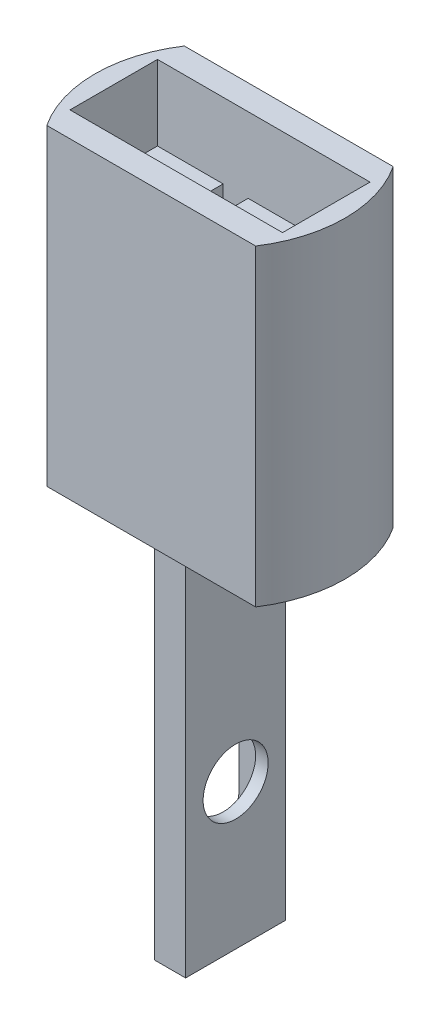
ISO-10303-21;
HEADER;
FILE_DESCRIPTION(('STEP AP214'),'2;1');
FILE_NAME('part.step','',(''),(''),'','','');
FILE_SCHEMA(('AUTOMOTIVE_DESIGN { 1 0 10303 214 1 1 1 1 }'));
ENDSEC;
DATA;
#1=APPLICATION_CONTEXT('core data for automotive mechanical design processes');
#2=APPLICATION_PROTOCOL_DEFINITION('international standard','automotive_design',2000,#1);
#3=PRODUCT_CONTEXT('',#1,'mechanical');
#4=PRODUCT('Part','Part','',(#3));
#5=PRODUCT_RELATED_PRODUCT_CATEGORY('part','',(#4));
#6=PRODUCT_DEFINITION_FORMATION('','',#4);
#7=PRODUCT_DEFINITION_CONTEXT('part definition',#1,'design');
#8=PRODUCT_DEFINITION('design','',#6,#7);
#9=PRODUCT_DEFINITION_SHAPE('','',#8);
#10=(LENGTH_UNIT() NAMED_UNIT(*) SI_UNIT(.MILLI.,.METRE.));
#11=(NAMED_UNIT(*) PLANE_ANGLE_UNIT() SI_UNIT($,.RADIAN.));
#12=(NAMED_UNIT(*) SI_UNIT($,.STERADIAN.) SOLID_ANGLE_UNIT());
#13=UNCERTAINTY_MEASURE_WITH_UNIT(LENGTH_MEASURE(1.E-05),#10,'distance_accuracy_value','');
#14=(GEOMETRIC_REPRESENTATION_CONTEXT(3) GLOBAL_UNCERTAINTY_ASSIGNED_CONTEXT((#13)) GLOBAL_UNIT_ASSIGNED_CONTEXT((#10,
#11,#12)) REPRESENTATION_CONTEXT('',''));
#15=CARTESIAN_POINT('',(0.,0.,0.));
#16=DIRECTION('',(0.,0.,1.));
#17=DIRECTION('',(1.,0.,0.));
#18=AXIS2_PLACEMENT_3D('',#15,#16,#17);
#19=CARTESIAN_POINT('',(0.249999999999999,-7.9,2.75));
#20=DIRECTION('',(0.,1.,0.));
#21=DIRECTION('',(0.,0.,1.));
#22=AXIS2_PLACEMENT_3D('',#19,#20,#21);
#23=PLANE('',#22);
#24=DIRECTION('',(0.,0.,-1.));
#25=VECTOR('',#24,1.);
#26=CARTESIAN_POINT('',(-1.25,-7.9,2.75));
#27=LINE('',#26,#25);
#28=CARTESIAN_POINT('',(-1.25,-7.9,1.4999749367178));
#29=VERTEX_POINT('',#28);
#30=CARTESIAN_POINT('',(-1.25,-7.9,-1.49997066480721));
#31=VERTEX_POINT('',#30);
#32=EDGE_CURVE('E62',#29,#31,#27,.T.);
#33=ORIENTED_EDGE('',*,*,#32,.T.);
#34=DIRECTION('',(1.,0.,0.));
#35=VECTOR('',#34,1.);
#36=CARTESIAN_POINT('',(0.249999999999999,-7.9,-1.4999749367178));
#37=LINE('',#36,#35);
#38=CARTESIAN_POINT('',(0.249999999999999,-7.9,-1.49997066480721));
#39=VERTEX_POINT('',#38);
#40=EDGE_CURVE('E11',#31,#39,#37,.T.);
#41=ORIENTED_EDGE('',*,*,#40,.T.);
#42=DIRECTION('',(0.,0.,-1.));
#43=VECTOR('',#42,1.);
#44=CARTESIAN_POINT('',(0.249999999999999,-7.9,2.75));
#45=LINE('',#44,#43);
#46=CARTESIAN_POINT('',(0.249999999999999,-7.9,1.49997066480721));
#47=VERTEX_POINT('',#46);
#48=EDGE_CURVE('E364',#47,#39,#45,.T.);
#49=ORIENTED_EDGE('',*,*,#48,.F.);
#50=DIRECTION('',(-1.,0.,0.));
#51=VECTOR('',#50,1.);
#52=CARTESIAN_POINT('',(0.249999999999999,-7.9,1.4999749367178));
#53=LINE('',#52,#51);
#54=EDGE_CURVE('E567',#47,#29,#53,.T.);
#55=ORIENTED_EDGE('',*,*,#54,.T.);
#56=EDGE_LOOP('',(#33,#41,#49,#55));
#57=FACE_BOUND('',#56,.T.);
#58=ADVANCED_FACE('F39',(#57),#23,.F.);
#59=CARTESIAN_POINT('',(-1.25,-7.9,2.75));
#60=VERTEX_POINT('',#59);
#61=CARTESIAN_POINT('',(-1.25,-7.9,2.7499706648072));
#62=VERTEX_POINT('',#61);
#63=EDGE_CURVE('E377',#60,#62,#27,.T.);
#64=ORIENTED_EDGE('',*,*,#63,.T.);
#65=DIRECTION('',(1.,0.,0.));
#66=VECTOR('',#65,1.);
#67=CARTESIAN_POINT('',(0.249999999999999,-7.9,2.7499706648072));
#68=LINE('',#67,#66);
#69=CARTESIAN_POINT('',(0.249999999999999,-7.9,2.7499706648072));
#70=VERTEX_POINT('',#69);
#71=EDGE_CURVE('E570',#62,#70,#68,.T.);
#72=ORIENTED_EDGE('',*,*,#71,.T.);
#73=CARTESIAN_POINT('',(0.249999999999999,-7.9,2.75));
#74=VERTEX_POINT('',#73);
#75=EDGE_CURVE('E359',#74,#70,#45,.T.);
#76=ORIENTED_EDGE('',*,*,#75,.F.);
#77=DIRECTION('',(-1.,0.,0.));
#78=VECTOR('',#77,1.);
#79=CARTESIAN_POINT('',(0.249999999999999,-7.9,2.75));
#80=LINE('',#79,#78);
#81=EDGE_CURVE('E373',#74,#60,#80,.T.);
#82=ORIENTED_EDGE('',*,*,#81,.T.);
#83=EDGE_LOOP('',(#64,#72,#76,#82));
#84=FACE_BOUND('',#83,.T.);
#85=ADVANCED_FACE('F634',(#84),#23,.F.);
#86=CARTESIAN_POINT('',(0.249999999999999,-28.9,2.75));
#87=DIRECTION('',(0.,-1.,0.));
#88=DIRECTION('',(0.,0.,-1.));
#89=AXIS2_PLACEMENT_3D('',#86,#87,#88);
#90=PLANE('',#89);
#91=DIRECTION('',(0.,0.,1.));
#92=VECTOR('',#91,1.);
#93=CARTESIAN_POINT('',(-1.25,-28.9,2.75));
#94=LINE('',#93,#92);
#95=CARTESIAN_POINT('',(-1.25,-28.9,-1.4999749367178));
#96=VERTEX_POINT('',#95);
#97=CARTESIAN_POINT('',(-1.25,-28.9,1.49997066480721));
#98=VERTEX_POINT('',#97);
#99=EDGE_CURVE('E387',#96,#98,#94,.T.);
#100=ORIENTED_EDGE('',*,*,#99,.T.);
#101=DIRECTION('',(1.,0.,0.));
#102=VECTOR('',#101,1.);
#103=CARTESIAN_POINT('',(0.249999999999999,-28.9,1.4999749367178));
#104=LINE('',#103,#102);
#105=CARTESIAN_POINT('',(0.249999999999999,-28.9,1.49997066480721));
#106=VERTEX_POINT('',#105);
#107=EDGE_CURVE('E564',#98,#106,#104,.T.);
#108=ORIENTED_EDGE('',*,*,#107,.T.);
#109=DIRECTION('',(0.,0.,1.));
#110=VECTOR('',#109,1.);
#111=CARTESIAN_POINT('',(0.249999999999999,-28.9,2.75));
#112=LINE('',#111,#110);
#113=CARTESIAN_POINT('',(0.249999999999999,-28.9,-1.49997066480721));
#114=VERTEX_POINT('',#113);
#115=EDGE_CURVE('E374',#114,#106,#112,.T.);
#116=ORIENTED_EDGE('',*,*,#115,.F.);
#117=DIRECTION('',(-1.,0.,0.));
#118=VECTOR('',#117,1.);
#119=CARTESIAN_POINT('',(0.249999999999999,-28.9,-1.4999749367178));
#120=LINE('',#119,#118);
#121=EDGE_CURVE('E553',#114,#96,#120,.T.);
#122=ORIENTED_EDGE('',*,*,#121,.T.);
#123=EDGE_LOOP('',(#100,#108,#116,#122));
#124=FACE_BOUND('',#123,.T.);
#125=ADVANCED_FACE('F592',(#124),#90,.F.);
#126=CARTESIAN_POINT('',(-1.25,-28.9,-2.75));
#127=VERTEX_POINT('',#126);
#128=CARTESIAN_POINT('',(-1.25,-28.9,-2.7499706648072));
#129=VERTEX_POINT('',#128);
#130=EDGE_CURVE('E358',#127,#129,#94,.T.);
#131=ORIENTED_EDGE('',*,*,#130,.T.);
#132=DIRECTION('',(1.,0.,0.));
#133=VECTOR('',#132,1.);
#134=CARTESIAN_POINT('',(0.249999999999999,-28.9,-2.7499706648072));
#135=LINE('',#134,#133);
#136=CARTESIAN_POINT('',(0.249999999999999,-28.9,-2.7499706648072));
#137=VERTEX_POINT('',#136);
#138=EDGE_CURVE('E557',#129,#137,#135,.T.);
#139=ORIENTED_EDGE('',*,*,#138,.T.);
#140=CARTESIAN_POINT('',(0.249999999999999,-28.9,-2.75));
#141=VERTEX_POINT('',#140);
#142=EDGE_CURVE('E369',#141,#137,#112,.T.);
#143=ORIENTED_EDGE('',*,*,#142,.F.);
#144=DIRECTION('',(-1.,0.,0.));
#145=VECTOR('',#144,1.);
#146=CARTESIAN_POINT('',(0.249999999999999,-28.9,-2.75));
#147=LINE('',#146,#145);
#148=EDGE_CURVE('E393',#141,#127,#147,.T.);
#149=ORIENTED_EDGE('',*,*,#148,.T.);
#150=EDGE_LOOP('',(#131,#139,#143,#149));
#151=FACE_BOUND('',#150,.T.);
#152=ADVANCED_FACE('F623',(#151),#90,.F.);
#153=CARTESIAN_POINT('',(0.,25.,0.));
#154=DIRECTION('',(0.,-1.,0.));
#155=DIRECTION('',(0.,0.,-1.));
#156=AXIS2_PLACEMENT_3D('',#153,#154,#155);
#157=CYLINDRICAL_SURFACE('',#156,10.);
#158=CARTESIAN_POINT('',(0.,25.,0.));
#159=DIRECTION('',(0.,1.,0.));
#160=DIRECTION('',(0.,0.,1.));
#161=AXIS2_PLACEMENT_3D('',#158,#159,#160);
#162=CIRCLE('',#161,10.);
#163=CARTESIAN_POINT('',(-8.35164654424503,25.,-5.5));
#164=VERTEX_POINT('',#163);
#165=CARTESIAN_POINT('',(-8.35164654424503,25.,5.5));
#166=VERTEX_POINT('',#165);
#167=EDGE_CURVE('E540',#164,#166,#162,.T.);
#168=ORIENTED_EDGE('',*,*,#167,.F.);
#169=DIRECTION('',(0.,-1.,0.));
#170=VECTOR('',#169,1.);
#171=CARTESIAN_POINT('',(-8.35164654424503,43.,-5.5));
#172=LINE('',#171,#170);
#173=CARTESIAN_POINT('',(-8.35164654424503,0.,-5.5));
#174=VERTEX_POINT('',#173);
#175=EDGE_CURVE('E338',#164,#174,#172,.T.);
#176=ORIENTED_EDGE('',*,*,#175,.T.);
#177=CARTESIAN_POINT('',(0.,0.,0.));
#178=DIRECTION('',(0.,1.,0.));
#179=DIRECTION('',(0.,0.,1.));
#180=AXIS2_PLACEMENT_3D('',#177,#178,#179);
#181=CIRCLE('',#180,10.);
#182=CARTESIAN_POINT('',(-8.35164654424503,0.,5.5));
#183=VERTEX_POINT('',#182);
#184=EDGE_CURVE('E534',#174,#183,#181,.T.);
#185=ORIENTED_EDGE('',*,*,#184,.T.);
#186=DIRECTION('',(0.,-1.,0.));
#187=VECTOR('',#186,1.);
#188=CARTESIAN_POINT('',(-8.35164654424503,43.,5.5));
#189=LINE('',#188,#187);
#190=EDGE_CURVE('E347',#166,#183,#189,.T.);
#191=ORIENTED_EDGE('',*,*,#190,.F.);
#192=EDGE_LOOP('',(#168,#176,#185,#191));
#193=FACE_BOUND('',#192,.T.);
#194=ADVANCED_FACE('F683',(#193),#157,.T.);
#195=CARTESIAN_POINT('',(-10.001,-18.4,0.));
#196=DIRECTION('',(1.,0.,0.));
#197=DIRECTION('',(0.,0.,-1.));
#198=AXIS2_PLACEMENT_3D('',#195,#196,#197);
#199=CYLINDRICAL_SURFACE('',#198,2.6);
#200=CARTESIAN_POINT('',(1.25,-18.4,0.));
#201=DIRECTION('',(1.,0.,0.));
#202=DIRECTION('',(0.,0.,-1.));
#203=AXIS2_PLACEMENT_3D('',#200,#201,#202);
#204=CIRCLE('',#203,2.6);
#205=CARTESIAN_POINT('',(1.25,-18.4,-2.6));
#206=VERTEX_POINT('',#205);
#207=EDGE_CURVE('E476',#206,#206,#204,.T.);
#208=ORIENTED_EDGE('',*,*,#207,.T.);
#209=EDGE_LOOP('',(#208));
#210=FACE_BOUND('',#209,.T.);
#211=CARTESIAN_POINT('',(0.249999999999999,-18.4,0.));
#212=DIRECTION('',(-1.,0.,0.));
#213=DIRECTION('',(0.,0.,1.));
#214=AXIS2_PLACEMENT_3D('',#211,#212,#213);
#215=CIRCLE('',#214,2.6);
#216=CARTESIAN_POINT('',(0.249999999999998,-18.4,2.6));
#217=VERTEX_POINT('',#216);
#218=EDGE_CURVE('E392',#217,#217,#215,.F.);
#219=ORIENTED_EDGE('',*,*,#218,.F.);
#220=EDGE_LOOP('',(#219));
#221=FACE_BOUND('',#220,.T.);
#222=ADVANCED_FACE('F663',(#210,#221),#199,.F.);
#223=CARTESIAN_POINT('',(0.,19.,0.));
#224=DIRECTION('',(0.,-1.,0.));
#225=DIRECTION('',(0.,0.,-1.));
#226=AXIS2_PLACEMENT_3D('',#223,#224,#225);
#227=PLANE('',#226);
#228=DIRECTION('',(0.,0.,-1.));
#229=VECTOR('',#228,1.);
#230=CARTESIAN_POINT('',(-1.25,19.,-3.5));
#231=LINE('',#230,#229);
#232=CARTESIAN_POINT('',(-1.25,19.,3.5));
#233=VERTEX_POINT('',#232);
#234=CARTESIAN_POINT('',(-1.25,19.,-3.5));
#235=VERTEX_POINT('',#234);
#236=EDGE_CURVE('E421',#233,#235,#231,.T.);
#237=ORIENTED_EDGE('',*,*,#236,.F.);
#238=DIRECTION('',(1.,0.,0.));
#239=VECTOR('',#238,1.);
#240=CARTESIAN_POINT('',(-8.5,19.,3.5));
#241=LINE('',#240,#239);
#242=CARTESIAN_POINT('',(8.5,19.,3.5));
#243=VERTEX_POINT('',#242);
#244=EDGE_CURVE('E444',#233,#243,#241,.T.);
#245=ORIENTED_EDGE('',*,*,#244,.T.);
#246=DIRECTION('',(0.,0.,-1.));
#247=VECTOR('',#246,1.);
#248=CARTESIAN_POINT('',(8.5,19.,3.5));
#249=LINE('',#248,#247);
#250=CARTESIAN_POINT('',(8.5,19.,-3.5));
#251=VERTEX_POINT('',#250);
#252=EDGE_CURVE('E450',#243,#251,#249,.T.);
#253=ORIENTED_EDGE('',*,*,#252,.T.);
#254=DIRECTION('',(-1.,0.,0.));
#255=VECTOR('',#254,1.);
#256=CARTESIAN_POINT('',(-8.5,19.,-3.5));
#257=LINE('',#256,#255);
#258=EDGE_CURVE('E455',#251,#235,#257,.T.);
#259=ORIENTED_EDGE('',*,*,#258,.T.);
#260=EDGE_LOOP('',(#237,#245,#253,#259));
#261=FACE_BOUND('',#260,.T.);
#262=ADVANCED_FACE('F659',(#261),#227,.F.);
#263=DIRECTION('',(0.,0.,1.));
#264=VECTOR('',#263,1.);
#265=CARTESIAN_POINT('',(-3.25,19.,-3.5));
#266=LINE('',#265,#264);
#267=CARTESIAN_POINT('',(-3.25,19.,-3.5));
#268=VERTEX_POINT('',#267);
#269=CARTESIAN_POINT('',(-3.25,19.,3.5));
#270=VERTEX_POINT('',#269);
#271=EDGE_CURVE('E408',#268,#270,#266,.T.);
#272=ORIENTED_EDGE('',*,*,#271,.F.);
#273=CARTESIAN_POINT('',(-8.5,19.,-3.5));
#274=VERTEX_POINT('',#273);
#275=EDGE_CURVE('E454',#268,#274,#257,.T.);
#276=ORIENTED_EDGE('',*,*,#275,.T.);
#277=DIRECTION('',(0.,0.,1.));
#278=VECTOR('',#277,1.);
#279=CARTESIAN_POINT('',(-8.5,19.,3.5));
#280=LINE('',#279,#278);
#281=CARTESIAN_POINT('',(-8.5,19.,3.5));
#282=VERTEX_POINT('',#281);
#283=EDGE_CURVE('E440',#274,#282,#280,.T.);
#284=ORIENTED_EDGE('',*,*,#283,.T.);
#285=EDGE_CURVE('E446',#282,#270,#241,.T.);
#286=ORIENTED_EDGE('',*,*,#285,.T.);
#287=EDGE_LOOP('',(#272,#276,#284,#286));
#288=FACE_BOUND('',#287,.T.);
#289=ADVANCED_FACE('F662',(#288),#227,.F.);
#290=CARTESIAN_POINT('',(0.,0.,0.));
#291=DIRECTION('',(0.,1.,0.));
#292=DIRECTION('',(0.,0.,1.));
#293=AXIS2_PLACEMENT_3D('',#290,#291,#292);
#294=PLANE('',#293);
#295=ORIENTED_EDGE('',*,*,#184,.F.);
#296=DIRECTION('',(-1.,0.,0.));
#297=VECTOR('',#296,1.);
#298=CARTESIAN_POINT('',(8.35164654424503,0.,-5.5));
#299=LINE('',#298,#297);
#300=CARTESIAN_POINT('',(8.35164654424503,0.,-5.5));
#301=VERTEX_POINT('',#300);
#302=EDGE_CURVE('E333',#301,#174,#299,.T.);
#303=ORIENTED_EDGE('',*,*,#302,.F.);
#304=CARTESIAN_POINT('',(8.35164654424503,0.,5.5));
#305=VERTEX_POINT('',#304);
#306=EDGE_CURVE('E541',#305,#301,#181,.T.);
#307=ORIENTED_EDGE('',*,*,#306,.F.);
#308=DIRECTION('',(1.,0.,0.));
#309=VECTOR('',#308,1.);
#310=CARTESIAN_POINT('',(8.35164654424503,0.,5.5));
#311=LINE('',#310,#309);
#312=EDGE_CURVE('E332',#183,#305,#311,.T.);
#313=ORIENTED_EDGE('',*,*,#312,.F.);
#314=EDGE_LOOP('',(#295,#303,#307,#313));
#315=FACE_BOUND('',#314,.T.);
#316=DIRECTION('',(0.,0.,1.));
#317=VECTOR('',#316,1.);
#318=CARTESIAN_POINT('',(1.25,0.,-4.));
#319=LINE('',#318,#317);
#320=CARTESIAN_POINT('',(1.25,0.,-4.));
#321=VERTEX_POINT('',#320);
#322=CARTESIAN_POINT('',(1.25,0.,4.));
#323=VERTEX_POINT('',#322);
#324=EDGE_CURVE('E489',#321,#323,#319,.T.);
#325=ORIENTED_EDGE('',*,*,#324,.F.);
#326=DIRECTION('',(1.,0.,0.));
#327=VECTOR('',#326,1.);
#328=CARTESIAN_POINT('',(-1.25,0.,-4.));
#329=LINE('',#328,#327);
#330=CARTESIAN_POINT('',(-1.25,0.,-4.));
#331=VERTEX_POINT('',#330);
#332=EDGE_CURVE('E495',#331,#321,#329,.T.);
#333=ORIENTED_EDGE('',*,*,#332,.F.);
#334=DIRECTION('',(0.,0.,-1.));
#335=VECTOR('',#334,1.);
#336=CARTESIAN_POINT('',(-1.25,0.,-4.));
#337=LINE('',#336,#335);
#338=CARTESIAN_POINT('',(-1.25,0.,4.));
#339=VERTEX_POINT('',#338);
#340=EDGE_CURVE('E512',#339,#331,#337,.T.);
#341=ORIENTED_EDGE('',*,*,#340,.F.);
#342=DIRECTION('',(-1.,0.,0.));
#343=VECTOR('',#342,1.);
#344=CARTESIAN_POINT('',(-1.25,0.,4.));
#345=LINE('',#344,#343);
#346=EDGE_CURVE('E508',#323,#339,#345,.T.);
#347=ORIENTED_EDGE('',*,*,#346,.F.);
#348=EDGE_LOOP('',(#325,#333,#341,#347));
#349=FACE_BOUND('',#348,.T.);
#350=ADVANCED_FACE('F705',(#315,#349),#294,.F.);
#351=ORIENTED_EDGE('',*,*,#306,.T.);
#352=DIRECTION('',(0.,-1.,0.));
#353=VECTOR('',#352,1.);
#354=CARTESIAN_POINT('',(8.35164654424503,43.,-5.5));
#355=LINE('',#354,#353);
#356=CARTESIAN_POINT('',(8.35164654424503,25.,-5.5));
#357=VERTEX_POINT('',#356);
#358=EDGE_CURVE('E336',#357,#301,#355,.T.);
#359=ORIENTED_EDGE('',*,*,#358,.F.);
#360=CARTESIAN_POINT('',(8.35164654424503,25.,5.5));
#361=VERTEX_POINT('',#360);
#362=EDGE_CURVE('E535',#361,#357,#162,.T.);
#363=ORIENTED_EDGE('',*,*,#362,.F.);
#364=DIRECTION('',(0.,-1.,0.));
#365=VECTOR('',#364,1.);
#366=CARTESIAN_POINT('',(8.35164654424503,43.,5.5));
#367=LINE('',#366,#365);
#368=EDGE_CURVE('E337',#361,#305,#367,.T.);
#369=ORIENTED_EDGE('',*,*,#368,.T.);
#370=EDGE_LOOP('',(#351,#359,#363,#369));
#371=FACE_BOUND('',#370,.T.);
#372=ADVANCED_FACE('F41',(#371),#157,.T.);
#373=CARTESIAN_POINT('',(0.,25.,0.));
#374=DIRECTION('',(0.,1.,0.));
#375=DIRECTION('',(0.,0.,1.));
#376=AXIS2_PLACEMENT_3D('',#373,#374,#375);
#377=PLANE('',#376);
#378=DIRECTION('',(1.,0.,0.));
#379=VECTOR('',#378,1.);
#380=CARTESIAN_POINT('',(0.,25.,-5.5));
#381=LINE('',#380,#379);
#382=EDGE_CURVE('E550',#164,#357,#381,.T.);
#383=ORIENTED_EDGE('',*,*,#382,.F.);
#384=ORIENTED_EDGE('',*,*,#167,.T.);
#385=DIRECTION('',(-1.,0.,0.));
#386=VECTOR('',#385,1.);
#387=CARTESIAN_POINT('',(0.,25.,5.5));
#388=LINE('',#387,#386);
#389=EDGE_CURVE('E539',#361,#166,#388,.T.);
#390=ORIENTED_EDGE('',*,*,#389,.F.);
#391=ORIENTED_EDGE('',*,*,#362,.T.);
#392=EDGE_LOOP('',(#383,#384,#390,#391));
#393=FACE_BOUND('',#392,.T.);
#394=DIRECTION('',(0.,0.,1.));
#395=VECTOR('',#394,1.);
#396=CARTESIAN_POINT('',(-8.5,25.,3.5));
#397=LINE('',#396,#395);
#398=CARTESIAN_POINT('',(-8.5,25.,-3.5));
#399=VERTEX_POINT('',#398);
#400=CARTESIAN_POINT('',(-8.5,25.,3.5));
#401=VERTEX_POINT('',#400);
#402=EDGE_CURVE('E431',#399,#401,#397,.T.);
#403=ORIENTED_EDGE('',*,*,#402,.F.);
#404=DIRECTION('',(-1.,0.,0.));
#405=VECTOR('',#404,1.);
#406=CARTESIAN_POINT('',(-8.5,25.,-3.5));
#407=LINE('',#406,#405);
#408=CARTESIAN_POINT('',(8.5,25.,-3.5));
#409=VERTEX_POINT('',#408);
#410=EDGE_CURVE('E445',#409,#399,#407,.T.);
#411=ORIENTED_EDGE('',*,*,#410,.F.);
#412=DIRECTION('',(0.,0.,-1.));
#413=VECTOR('',#412,1.);
#414=CARTESIAN_POINT('',(8.5,25.,3.5));
#415=LINE('',#414,#413);
#416=CARTESIAN_POINT('',(8.5,25.,3.5));
#417=VERTEX_POINT('',#416);
#418=EDGE_CURVE('E466',#417,#409,#415,.T.);
#419=ORIENTED_EDGE('',*,*,#418,.F.);
#420=DIRECTION('',(1.,0.,0.));
#421=VECTOR('',#420,1.);
#422=CARTESIAN_POINT('',(-8.5,25.,3.5));
#423=LINE('',#422,#421);
#424=EDGE_CURVE('E462',#401,#417,#423,.T.);
#425=ORIENTED_EDGE('',*,*,#424,.F.);
#426=EDGE_LOOP('',(#403,#411,#419,#425));
#427=FACE_BOUND('',#426,.T.);
#428=ADVANCED_FACE('F701',(#393,#427),#377,.T.);
#429=CARTESIAN_POINT('',(1.25,-30.,-4.));
#430=DIRECTION('',(-1.,0.,0.));
#431=DIRECTION('',(0.,0.,1.));
#432=AXIS2_PLACEMENT_3D('',#429,#430,#431);
#433=PLANE('',#432);
#434=ORIENTED_EDGE('',*,*,#207,.F.);
#435=EDGE_LOOP('',(#434));
#436=FACE_BOUND('',#435,.T.);
#437=ORIENTED_EDGE('',*,*,#324,.T.);
#438=DIRECTION('',(0.,1.,0.));
#439=VECTOR('',#438,1.);
#440=CARTESIAN_POINT('',(1.25,-30.,4.));
#441=LINE('',#440,#439);
#442=CARTESIAN_POINT('',(1.25,-30.,4.));
#443=VERTEX_POINT('',#442);
#444=EDGE_CURVE('E530',#443,#323,#441,.T.);
#445=ORIENTED_EDGE('',*,*,#444,.F.);
#446=DIRECTION('',(0.,0.,1.));
#447=VECTOR('',#446,1.);
#448=CARTESIAN_POINT('',(1.25,-30.,-4.));
#449=LINE('',#448,#447);
#450=CARTESIAN_POINT('',(1.25,-30.,-4.));
#451=VERTEX_POINT('',#450);
#452=EDGE_CURVE('E490',#451,#443,#449,.T.);
#453=ORIENTED_EDGE('',*,*,#452,.F.);
#454=DIRECTION('',(0.,1.,0.));
#455=VECTOR('',#454,1.);
#456=CARTESIAN_POINT('',(1.25,-30.,-4.));
#457=LINE('',#456,#455);
#458=EDGE_CURVE('E504',#451,#321,#457,.T.);
#459=ORIENTED_EDGE('',*,*,#458,.T.);
#460=EDGE_LOOP('',(#437,#445,#453,#459));
#461=FACE_BOUND('',#460,.T.);
#462=ADVANCED_FACE('F697',(#436,#461),#433,.F.);
#463=CARTESIAN_POINT('',(-1.25,-30.,4.));
#464=DIRECTION('',(0.,0.,-1.));
#465=DIRECTION('',(-1.,0.,0.));
#466=AXIS2_PLACEMENT_3D('',#463,#464,#465);
#467=PLANE('',#466);
#468=ORIENTED_EDGE('',*,*,#346,.T.);
#469=DIRECTION('',(0.,1.,0.));
#470=VECTOR('',#469,1.);
#471=CARTESIAN_POINT('',(-1.25,-30.,4.));
#472=LINE('',#471,#470);
#473=CARTESIAN_POINT('',(-1.25,-30.,4.));
#474=VERTEX_POINT('',#473);
#475=EDGE_CURVE('E526',#474,#339,#472,.T.);
#476=ORIENTED_EDGE('',*,*,#475,.F.);
#477=DIRECTION('',(-1.,0.,0.));
#478=VECTOR('',#477,1.);
#479=CARTESIAN_POINT('',(-1.25,-30.,4.));
#480=LINE('',#479,#478);
#481=EDGE_CURVE('E494',#443,#474,#480,.T.);
#482=ORIENTED_EDGE('',*,*,#481,.F.);
#483=ORIENTED_EDGE('',*,*,#444,.T.);
#484=EDGE_LOOP('',(#468,#476,#482,#483));
#485=FACE_BOUND('',#484,.T.);
#486=ADVANCED_FACE('F694',(#485),#467,.F.);
#487=CARTESIAN_POINT('',(-1.25,-30.,-4.));
#488=DIRECTION('',(1.,0.,0.));
#489=DIRECTION('',(0.,0.,-1.));
#490=AXIS2_PLACEMENT_3D('',#487,#488,#489);
#491=PLANE('',#490);
#492=DIRECTION('',(0.,0.984427575508482,0.175790638483658));
#493=VECTOR('',#492,1.);
#494=CARTESIAN_POINT('',(-1.25,-14.8999760773006,-2.7499706648072));
#495=LINE('',#494,#493);
#496=CARTESIAN_POINT('',(-1.25,-14.8999760773006,-2.7499706648072));
#497=VERTEX_POINT('',#496);
#498=EDGE_CURVE('E254',#497,#31,#495,.T.);
#499=ORIENTED_EDGE('',*,*,#498,.T.);
#500=ORIENTED_EDGE('',*,*,#32,.F.);
#501=DIRECTION('',(0.,-0.984427575508482,0.175790638483658));
#502=VECTOR('',#501,1.);
#503=CARTESIAN_POINT('',(-1.25,-14.8999760773006,2.7499706648072));
#504=LINE('',#503,#502);
#505=CARTESIAN_POINT('',(-1.25,-14.8999760773006,2.7499706648072));
#506=VERTEX_POINT('',#505);
#507=EDGE_CURVE('E268',#29,#506,#504,.T.);
#508=ORIENTED_EDGE('',*,*,#507,.T.);
#509=DIRECTION('',(0.,1.,0.));
#510=VECTOR('',#509,1.);
#511=CARTESIAN_POINT('',(-1.25,-7.89997607730071,2.7499706648072));
#512=LINE('',#511,#510);
#513=EDGE_CURVE('E281',#506,#62,#512,.T.);
#514=ORIENTED_EDGE('',*,*,#513,.T.);
#515=ORIENTED_EDGE('',*,*,#63,.F.);
#516=DIRECTION('',(0.,1.,0.));
#517=VECTOR('',#516,1.);
#518=CARTESIAN_POINT('',(-1.25,-28.9,2.75));
#519=LINE('',#518,#517);
#520=CARTESIAN_POINT('',(-1.25,-28.9,2.75));
#521=VERTEX_POINT('',#520);
#522=EDGE_CURVE('E342',#521,#60,#519,.T.);
#523=ORIENTED_EDGE('',*,*,#522,.F.);
#524=CARTESIAN_POINT('',(-1.25,-28.9,2.7499706648072));
#525=VERTEX_POINT('',#524);
#526=EDGE_CURVE('E384',#525,#521,#94,.T.);
#527=ORIENTED_EDGE('',*,*,#526,.F.);
#528=DIRECTION('',(0.,1.,0.));
#529=VECTOR('',#528,1.);
#530=CARTESIAN_POINT('',(-1.25,-28.9000239226993,2.7499706648072));
#531=LINE('',#530,#529);
#532=CARTESIAN_POINT('',(-1.25,-21.9000239226994,2.7499706648072));
#533=VERTEX_POINT('',#532);
#534=EDGE_CURVE('E300',#525,#533,#531,.T.);
#535=ORIENTED_EDGE('',*,*,#534,.T.);
#536=DIRECTION('',(0.,-0.984427575508482,-0.175790638483658));
#537=VECTOR('',#536,1.);
#538=CARTESIAN_POINT('',(-1.25,-21.9000239226994,2.7499706648072));
#539=LINE('',#538,#537);
#540=EDGE_CURVE('E294',#533,#98,#539,.T.);
#541=ORIENTED_EDGE('',*,*,#540,.T.);
#542=ORIENTED_EDGE('',*,*,#99,.F.);
#543=DIRECTION('',(0.,0.984427575508482,-0.175790638483658));
#544=VECTOR('',#543,1.);
#545=CARTESIAN_POINT('',(-1.25,-21.9000239226994,-2.7499706648072));
#546=LINE('',#545,#544);
#547=CARTESIAN_POINT('',(-1.25,-21.9000239226994,-2.7499706648072));
#548=VERTEX_POINT('',#547);
#549=EDGE_CURVE('E313',#96,#548,#546,.T.);
#550=ORIENTED_EDGE('',*,*,#549,.T.);
#551=DIRECTION('',(0.,-1.,0.));
#552=VECTOR('',#551,1.);
#553=CARTESIAN_POINT('',(-1.25,-28.9000239226993,-2.7499706648072));
#554=LINE('',#553,#552);
#555=EDGE_CURVE('E319',#548,#129,#554,.T.);
#556=ORIENTED_EDGE('',*,*,#555,.T.);
#557=ORIENTED_EDGE('',*,*,#130,.F.);
#558=DIRECTION('',(0.,-1.,0.));
#559=VECTOR('',#558,1.);
#560=CARTESIAN_POINT('',(-1.25,-28.9,-2.75));
#561=LINE('',#560,#559);
#562=CARTESIAN_POINT('',(-1.25,-7.9,-2.75));
#563=VERTEX_POINT('',#562);
#564=EDGE_CURVE('E380',#563,#127,#561,.T.);
#565=ORIENTED_EDGE('',*,*,#564,.F.);
#566=CARTESIAN_POINT('',(-1.25,-7.9,-2.7499706648072));
#567=VERTEX_POINT('',#566);
#568=EDGE_CURVE('E256',#567,#563,#27,.T.);
#569=ORIENTED_EDGE('',*,*,#568,.F.);
#570=DIRECTION('',(0.,-1.,0.));
#571=VECTOR('',#570,1.);
#572=CARTESIAN_POINT('',(-1.25,-7.89997607730071,-2.7499706648072));
#573=LINE('',#572,#571);
#574=EDGE_CURVE('E249',#567,#497,#573,.T.);
#575=ORIENTED_EDGE('',*,*,#574,.T.);
#576=EDGE_LOOP('',(#499,#500,#508,#514,#515,#523,#527,#535,#541,#542,#550,#556,#557,#565,#569,#575));
#577=FACE_BOUND('',#576,.T.);
#578=ORIENTED_EDGE('',*,*,#340,.T.);
#579=DIRECTION('',(0.,1.,0.));
#580=VECTOR('',#579,1.);
#581=CARTESIAN_POINT('',(-1.25,-30.,-4.));
#582=LINE('',#581,#580);
#583=CARTESIAN_POINT('',(-1.25,-30.,-4.));
#584=VERTEX_POINT('',#583);
#585=EDGE_CURVE('E522',#584,#331,#582,.T.);
#586=ORIENTED_EDGE('',*,*,#585,.F.);
#587=DIRECTION('',(0.,0.,-1.));
#588=VECTOR('',#587,1.);
#589=CARTESIAN_POINT('',(-1.25,-30.,-4.));
#590=LINE('',#589,#588);
#591=EDGE_CURVE('E498',#474,#584,#590,.T.);
#592=ORIENTED_EDGE('',*,*,#591,.F.);
#593=ORIENTED_EDGE('',*,*,#475,.T.);
#594=EDGE_LOOP('',(#578,#586,#592,#593));
#595=FACE_BOUND('',#594,.T.);
#596=ADVANCED_FACE('F251',(#577,#595),#491,.F.);
#597=CARTESIAN_POINT('',(-1.25,-30.,-4.));
#598=DIRECTION('',(0.,0.,1.));
#599=DIRECTION('',(1.,0.,0.));
#600=AXIS2_PLACEMENT_3D('',#597,#598,#599);
#601=PLANE('',#600);
#602=ORIENTED_EDGE('',*,*,#332,.T.);
#603=ORIENTED_EDGE('',*,*,#458,.F.);
#604=DIRECTION('',(1.,0.,0.));
#605=VECTOR('',#604,1.);
#606=CARTESIAN_POINT('',(-1.25,-30.,-4.));
#607=LINE('',#606,#605);
#608=EDGE_CURVE('E501',#584,#451,#607,.T.);
#609=ORIENTED_EDGE('',*,*,#608,.F.);
#610=ORIENTED_EDGE('',*,*,#585,.T.);
#611=EDGE_LOOP('',(#602,#603,#609,#610));
#612=FACE_BOUND('',#611,.T.);
#613=ADVANCED_FACE('F687',(#612),#601,.F.);
#614=CARTESIAN_POINT('',(0.,-30.,0.));
#615=DIRECTION('',(0.,1.,0.));
#616=DIRECTION('',(0.,0.,1.));
#617=AXIS2_PLACEMENT_3D('',#614,#615,#616);
#618=PLANE('',#617);
#619=ORIENTED_EDGE('',*,*,#452,.T.);
#620=ORIENTED_EDGE('',*,*,#481,.T.);
#621=ORIENTED_EDGE('',*,*,#591,.T.);
#622=ORIENTED_EDGE('',*,*,#608,.T.);
#623=EDGE_LOOP('',(#619,#620,#621,#622));
#624=FACE_BOUND('',#623,.T.);
#625=ADVANCED_FACE('F679',(#624),#618,.F.);
#626=CARTESIAN_POINT('',(-8.5,19.,3.5));
#627=DIRECTION('',(-1.,0.,0.));
#628=DIRECTION('',(0.,0.,1.));
#629=AXIS2_PLACEMENT_3D('',#626,#627,#628);
#630=PLANE('',#629);
#631=ORIENTED_EDGE('',*,*,#402,.T.);
#632=DIRECTION('',(0.,1.,0.));
#633=VECTOR('',#632,1.);
#634=CARTESIAN_POINT('',(-8.5,19.,3.5));
#635=LINE('',#634,#633);
#636=EDGE_CURVE('E459',#282,#401,#635,.T.);
#637=ORIENTED_EDGE('',*,*,#636,.F.);
#638=ORIENTED_EDGE('',*,*,#283,.F.);
#639=DIRECTION('',(0.,1.,0.));
#640=VECTOR('',#639,1.);
#641=CARTESIAN_POINT('',(-8.5,19.,-3.5));
#642=LINE('',#641,#640);
#643=EDGE_CURVE('E473',#274,#399,#642,.T.);
#644=ORIENTED_EDGE('',*,*,#643,.T.);
#645=EDGE_LOOP('',(#631,#637,#638,#644));
#646=FACE_BOUND('',#645,.T.);
#647=ADVANCED_FACE('F669',(#646),#630,.F.);
#648=CARTESIAN_POINT('',(-8.5,19.,-3.5));
#649=DIRECTION('',(0.,0.,-1.));
#650=DIRECTION('',(-1.,0.,0.));
#651=AXIS2_PLACEMENT_3D('',#648,#649,#650);
#652=PLANE('',#651);
#653=ORIENTED_EDGE('',*,*,#410,.T.);
#654=ORIENTED_EDGE('',*,*,#643,.F.);
#655=ORIENTED_EDGE('',*,*,#275,.F.);
#656=DIRECTION('',(0.,1.,0.));
#657=VECTOR('',#656,1.);
#658=CARTESIAN_POINT('',(-3.25,15.,-3.5));
#659=LINE('',#658,#657);
#660=CARTESIAN_POINT('',(-3.25,15.,-3.5));
#661=VERTEX_POINT('',#660);
#662=EDGE_CURVE('E435',#661,#268,#659,.T.);
#663=ORIENTED_EDGE('',*,*,#662,.F.);
#664=DIRECTION('',(-1.,0.,0.));
#665=VECTOR('',#664,1.);
#666=CARTESIAN_POINT('',(-1.25,15.,-3.5));
#667=LINE('',#666,#665);
#668=CARTESIAN_POINT('',(-1.25,15.,-3.5));
#669=VERTEX_POINT('',#668);
#670=EDGE_CURVE('E407',#669,#661,#667,.T.);
#671=ORIENTED_EDGE('',*,*,#670,.F.);
#672=DIRECTION('',(0.,1.,0.));
#673=VECTOR('',#672,1.);
#674=CARTESIAN_POINT('',(-1.25,15.,-3.5));
#675=LINE('',#674,#673);
#676=EDGE_CURVE('E420',#669,#235,#675,.T.);
#677=ORIENTED_EDGE('',*,*,#676,.T.);
#678=ORIENTED_EDGE('',*,*,#258,.F.);
#679=DIRECTION('',(0.,1.,0.));
#680=VECTOR('',#679,1.);
#681=CARTESIAN_POINT('',(8.5,19.,-3.5));
#682=LINE('',#681,#680);
#683=EDGE_CURVE('E477',#251,#409,#682,.T.);
#684=ORIENTED_EDGE('',*,*,#683,.T.);
#685=EDGE_LOOP('',(#653,#654,#655,#663,#671,#677,#678,#684));
#686=FACE_BOUND('',#685,.T.);
#687=ADVANCED_FACE('F665',(#686),#652,.F.);
#688=CARTESIAN_POINT('',(8.5,19.,3.5));
#689=DIRECTION('',(1.,0.,0.));
#690=DIRECTION('',(0.,0.,-1.));
#691=AXIS2_PLACEMENT_3D('',#688,#689,#690);
#692=PLANE('',#691);
#693=ORIENTED_EDGE('',*,*,#418,.T.);
#694=ORIENTED_EDGE('',*,*,#683,.F.);
#695=ORIENTED_EDGE('',*,*,#252,.F.);
#696=DIRECTION('',(0.,1.,0.));
#697=VECTOR('',#696,1.);
#698=CARTESIAN_POINT('',(8.5,19.,3.5));
#699=LINE('',#698,#697);
#700=EDGE_CURVE('E480',#243,#417,#699,.T.);
#701=ORIENTED_EDGE('',*,*,#700,.T.);
#702=EDGE_LOOP('',(#693,#694,#695,#701));
#703=FACE_BOUND('',#702,.T.);
#704=ADVANCED_FACE('F668',(#703),#692,.F.);
#705=CARTESIAN_POINT('',(-8.5,19.,3.5));
#706=DIRECTION('',(0.,0.,1.));
#707=DIRECTION('',(1.,0.,0.));
#708=AXIS2_PLACEMENT_3D('',#705,#706,#707);
#709=PLANE('',#708);
#710=ORIENTED_EDGE('',*,*,#424,.T.);
#711=ORIENTED_EDGE('',*,*,#700,.F.);
#712=ORIENTED_EDGE('',*,*,#244,.F.);
#713=DIRECTION('',(0.,1.,0.));
#714=VECTOR('',#713,1.);
#715=CARTESIAN_POINT('',(-1.25,15.,3.5));
#716=LINE('',#715,#714);
#717=CARTESIAN_POINT('',(-1.25,15.,3.5));
#718=VERTEX_POINT('',#717);
#719=EDGE_CURVE('E428',#718,#233,#716,.T.);
#720=ORIENTED_EDGE('',*,*,#719,.F.);
#721=DIRECTION('',(1.,0.,0.));
#722=VECTOR('',#721,1.);
#723=CARTESIAN_POINT('',(-1.25,15.,3.5));
#724=LINE('',#723,#722);
#725=CARTESIAN_POINT('',(-3.25,15.,3.5));
#726=VERTEX_POINT('',#725);
#727=EDGE_CURVE('E416',#726,#718,#724,.T.);
#728=ORIENTED_EDGE('',*,*,#727,.F.);
#729=DIRECTION('',(0.,1.,0.));
#730=VECTOR('',#729,1.);
#731=CARTESIAN_POINT('',(-3.25,15.,3.5));
#732=LINE('',#731,#730);
#733=EDGE_CURVE('E432',#726,#270,#732,.T.);
#734=ORIENTED_EDGE('',*,*,#733,.T.);
#735=ORIENTED_EDGE('',*,*,#285,.F.);
#736=ORIENTED_EDGE('',*,*,#636,.T.);
#737=EDGE_LOOP('',(#710,#711,#712,#720,#728,#734,#735,#736));
#738=FACE_BOUND('',#737,.T.);
#739=ADVANCED_FACE('F657',(#738),#709,.F.);
#740=CARTESIAN_POINT('',(-1.25,15.,-3.5));
#741=DIRECTION('',(1.,0.,0.));
#742=DIRECTION('',(0.,0.,-1.));
#743=AXIS2_PLACEMENT_3D('',#740,#741,#742);
#744=PLANE('',#743);
#745=ORIENTED_EDGE('',*,*,#236,.T.);
#746=ORIENTED_EDGE('',*,*,#676,.F.);
#747=DIRECTION('',(0.,0.,-1.));
#748=VECTOR('',#747,1.);
#749=CARTESIAN_POINT('',(-1.25,15.,-3.5));
#750=LINE('',#749,#748);
#751=EDGE_CURVE('E403',#718,#669,#750,.T.);
#752=ORIENTED_EDGE('',*,*,#751,.F.);
#753=ORIENTED_EDGE('',*,*,#719,.T.);
#754=EDGE_LOOP('',(#745,#746,#752,#753));
#755=FACE_BOUND('',#754,.T.);
#756=ADVANCED_FACE('F653',(#755),#744,.F.);
#757=CARTESIAN_POINT('',(-3.25,15.,-3.5));
#758=DIRECTION('',(-1.,0.,0.));
#759=DIRECTION('',(0.,0.,1.));
#760=AXIS2_PLACEMENT_3D('',#757,#758,#759);
#761=PLANE('',#760);
#762=ORIENTED_EDGE('',*,*,#271,.T.);
#763=ORIENTED_EDGE('',*,*,#733,.F.);
#764=DIRECTION('',(0.,0.,1.));
#765=VECTOR('',#764,1.);
#766=CARTESIAN_POINT('',(-3.25,15.,-3.5));
#767=LINE('',#766,#765);
#768=EDGE_CURVE('E412',#661,#726,#767,.T.);
#769=ORIENTED_EDGE('',*,*,#768,.F.);
#770=ORIENTED_EDGE('',*,*,#662,.T.);
#771=EDGE_LOOP('',(#762,#763,#769,#770));
#772=FACE_BOUND('',#771,.T.);
#773=ADVANCED_FACE('F649',(#772),#761,.F.);
#774=CARTESIAN_POINT('',(0.,15.,0.));
#775=DIRECTION('',(0.,-1.,0.));
#776=DIRECTION('',(0.,0.,-1.));
#777=AXIS2_PLACEMENT_3D('',#774,#775,#776);
#778=PLANE('',#777);
#779=ORIENTED_EDGE('',*,*,#751,.T.);
#780=ORIENTED_EDGE('',*,*,#670,.T.);
#781=ORIENTED_EDGE('',*,*,#768,.T.);
#782=ORIENTED_EDGE('',*,*,#727,.T.);
#783=EDGE_LOOP('',(#779,#780,#781,#782));
#784=FACE_BOUND('',#783,.T.);
#785=ADVANCED_FACE('F646',(#784),#778,.F.);
#786=CARTESIAN_POINT('',(0.249999999999999,0.,0.));
#787=DIRECTION('',(-1.,0.,0.));
#788=DIRECTION('',(0.,0.,1.));
#789=AXIS2_PLACEMENT_3D('',#786,#787,#788);
#790=PLANE('',#789);
#791=DIRECTION('',(0.,0.984427575508482,0.175790638483658));
#792=VECTOR('',#791,1.);
#793=CARTESIAN_POINT('',(0.249999999999999,-14.8999760773006,-2.7499706648072));
#794=LINE('',#793,#792);
#795=CARTESIAN_POINT('',(0.249999999999999,-14.8999760773006,-2.7499706648072));
#796=VERTEX_POINT('',#795);
#797=EDGE_CURVE('E55',#796,#39,#794,.T.);
#798=ORIENTED_EDGE('',*,*,#797,.F.);
#799=DIRECTION('',(0.,-1.,0.));
#800=VECTOR('',#799,1.);
#801=CARTESIAN_POINT('',(0.249999999999999,-7.89997607730071,-2.7499706648072));
#802=LINE('',#801,#800);
#803=CARTESIAN_POINT('',(0.249999999999999,-7.9,-2.7499706648072));
#804=VERTEX_POINT('',#803);
#805=EDGE_CURVE('E265',#804,#796,#802,.T.);
#806=ORIENTED_EDGE('',*,*,#805,.F.);
#807=CARTESIAN_POINT('',(0.249999999999999,-7.9,-2.75));
#808=VERTEX_POINT('',#807);
#809=EDGE_CURVE('E357',#804,#808,#45,.T.);
#810=ORIENTED_EDGE('',*,*,#809,.T.);
#811=DIRECTION('',(0.,-1.,0.));
#812=VECTOR('',#811,1.);
#813=CARTESIAN_POINT('',(0.249999999999999,-28.9,-2.75));
#814=LINE('',#813,#812);
#815=EDGE_CURVE('E363',#808,#141,#814,.T.);
#816=ORIENTED_EDGE('',*,*,#815,.T.);
#817=ORIENTED_EDGE('',*,*,#142,.T.);
#818=DIRECTION('',(0.,-1.,0.));
#819=VECTOR('',#818,1.);
#820=CARTESIAN_POINT('',(0.249999999999999,-28.9000239226993,-2.7499706648072));
#821=LINE('',#820,#819);
#822=CARTESIAN_POINT('',(0.249999999999999,-21.9000239226994,-2.7499706648072));
#823=VERTEX_POINT('',#822);
#824=EDGE_CURVE('E318',#823,#137,#821,.T.);
#825=ORIENTED_EDGE('',*,*,#824,.F.);
#826=DIRECTION('',(0.,0.984427575508482,-0.175790638483658));
#827=VECTOR('',#826,1.);
#828=CARTESIAN_POINT('',(0.249999999999999,-21.9000239226994,-2.7499706648072));
#829=LINE('',#828,#827);
#830=EDGE_CURVE('E314',#114,#823,#829,.T.);
#831=ORIENTED_EDGE('',*,*,#830,.F.);
#832=ORIENTED_EDGE('',*,*,#115,.T.);
#833=DIRECTION('',(0.,-0.984427575508482,-0.175790638483658));
#834=VECTOR('',#833,1.);
#835=CARTESIAN_POINT('',(0.249999999999999,-21.9000239226994,2.7499706648072));
#836=LINE('',#835,#834);
#837=CARTESIAN_POINT('',(0.249999999999999,-21.9000239226994,2.7499706648072));
#838=VERTEX_POINT('',#837);
#839=EDGE_CURVE('E295',#838,#106,#836,.T.);
#840=ORIENTED_EDGE('',*,*,#839,.F.);
#841=DIRECTION('',(0.,1.,0.));
#842=VECTOR('',#841,1.);
#843=CARTESIAN_POINT('',(0.249999999999999,-28.9000239226993,2.7499706648072));
#844=LINE('',#843,#842);
#845=CARTESIAN_POINT('',(0.249999999999999,-28.9,2.7499706648072));
#846=VERTEX_POINT('',#845);
#847=EDGE_CURVE('E299',#846,#838,#844,.T.);
#848=ORIENTED_EDGE('',*,*,#847,.F.);
#849=CARTESIAN_POINT('',(0.249999999999999,-28.9,2.75));
#850=VERTEX_POINT('',#849);
#851=EDGE_CURVE('E368',#846,#850,#112,.T.);
#852=ORIENTED_EDGE('',*,*,#851,.T.);
#853=DIRECTION('',(0.,1.,0.));
#854=VECTOR('',#853,1.);
#855=CARTESIAN_POINT('',(0.249999999999999,-28.9,2.75));
#856=LINE('',#855,#854);
#857=EDGE_CURVE('E353',#850,#74,#856,.T.);
#858=ORIENTED_EDGE('',*,*,#857,.T.);
#859=ORIENTED_EDGE('',*,*,#75,.T.);
#860=DIRECTION('',(0.,1.,0.));
#861=VECTOR('',#860,1.);
#862=CARTESIAN_POINT('',(0.249999999999999,-7.89997607730071,2.7499706648072));
#863=LINE('',#862,#861);
#864=CARTESIAN_POINT('',(0.249999999999999,-14.8999760773006,2.7499706648072));
#865=VERTEX_POINT('',#864);
#866=EDGE_CURVE('E280',#865,#70,#863,.T.);
#867=ORIENTED_EDGE('',*,*,#866,.F.);
#868=DIRECTION('',(0.,-0.984427575508482,0.175790638483658));
#869=VECTOR('',#868,1.);
#870=CARTESIAN_POINT('',(0.249999999999999,-14.8999760773006,2.7499706648072));
#871=LINE('',#870,#869);
#872=EDGE_CURVE('E276',#47,#865,#871,.T.);
#873=ORIENTED_EDGE('',*,*,#872,.F.);
#874=ORIENTED_EDGE('',*,*,#48,.T.);
#875=EDGE_LOOP('',(#798,#806,#810,#816,#817,#825,#831,#832,#840,#848,#852,#858,#859,#867,#873,#874));
#876=FACE_BOUND('',#875,.T.);
#877=ORIENTED_EDGE('',*,*,#218,.T.);
#878=EDGE_LOOP('',(#877));
#879=FACE_BOUND('',#878,.T.);
#880=ADVANCED_FACE('F581',(#876,#879),#790,.T.);
#881=CARTESIAN_POINT('',(0.249999999999999,-28.9,2.75));
#882=DIRECTION('',(0.,0.,1.));
#883=DIRECTION('',(1.,0.,0.));
#884=AXIS2_PLACEMENT_3D('',#881,#882,#883);
#885=PLANE('',#884);
#886=ORIENTED_EDGE('',*,*,#522,.T.);
#887=ORIENTED_EDGE('',*,*,#81,.F.);
#888=ORIENTED_EDGE('',*,*,#857,.F.);
#889=DIRECTION('',(-1.,0.,0.));
#890=VECTOR('',#889,1.);
#891=CARTESIAN_POINT('',(0.249999999999999,-28.9,2.75));
#892=LINE('',#891,#890);
#893=EDGE_CURVE('E388',#850,#521,#892,.T.);
#894=ORIENTED_EDGE('',*,*,#893,.T.);
#895=EDGE_LOOP('',(#886,#887,#888,#894));
#896=FACE_BOUND('',#895,.T.);
#897=ADVANCED_FACE('F635',(#896),#885,.F.);
#898=ORIENTED_EDGE('',*,*,#851,.F.);
#899=DIRECTION('',(-1.,0.,0.));
#900=VECTOR('',#899,1.);
#901=CARTESIAN_POINT('',(0.249999999999999,-28.9,2.7499706648072));
#902=LINE('',#901,#900);
#903=EDGE_CURVE('E560',#846,#525,#902,.T.);
#904=ORIENTED_EDGE('',*,*,#903,.T.);
#905=ORIENTED_EDGE('',*,*,#526,.T.);
#906=ORIENTED_EDGE('',*,*,#893,.F.);
#907=EDGE_LOOP('',(#898,#904,#905,#906));
#908=FACE_BOUND('',#907,.T.);
#909=ADVANCED_FACE('F609',(#908),#90,.F.);
#910=CARTESIAN_POINT('',(0.249999999999999,-28.9,-2.75));
#911=DIRECTION('',(0.,0.,-1.));
#912=DIRECTION('',(-1.,0.,0.));
#913=AXIS2_PLACEMENT_3D('',#910,#911,#912);
#914=PLANE('',#913);
#915=ORIENTED_EDGE('',*,*,#564,.T.);
#916=ORIENTED_EDGE('',*,*,#148,.F.);
#917=ORIENTED_EDGE('',*,*,#815,.F.);
#918=DIRECTION('',(-1.,0.,0.));
#919=VECTOR('',#918,1.);
#920=CARTESIAN_POINT('',(0.249999999999999,-7.9,-2.75));
#921=LINE('',#920,#919);
#922=EDGE_CURVE('E396',#808,#563,#921,.T.);
#923=ORIENTED_EDGE('',*,*,#922,.T.);
#924=EDGE_LOOP('',(#915,#916,#917,#923));
#925=FACE_BOUND('',#924,.T.);
#926=ADVANCED_FACE('F625',(#925),#914,.F.);
#927=ORIENTED_EDGE('',*,*,#809,.F.);
#928=DIRECTION('',(-1.,0.,0.));
#929=VECTOR('',#928,1.);
#930=CARTESIAN_POINT('',(0.249999999999999,-7.9,-2.7499706648072));
#931=LINE('',#930,#929);
#932=EDGE_CURVE('E48',#804,#567,#931,.T.);
#933=ORIENTED_EDGE('',*,*,#932,.T.);
#934=ORIENTED_EDGE('',*,*,#568,.T.);
#935=ORIENTED_EDGE('',*,*,#922,.F.);
#936=EDGE_LOOP('',(#927,#933,#934,#935));
#937=FACE_BOUND('',#936,.T.);
#938=ADVANCED_FACE('F575',(#937),#23,.F.);
#939=CARTESIAN_POINT('',(8.35164654424503,43.,5.5));
#940=DIRECTION('',(0.,0.,-1.));
#941=DIRECTION('',(-1.,0.,0.));
#942=AXIS2_PLACEMENT_3D('',#939,#940,#941);
#943=PLANE('',#942);
#944=ORIENTED_EDGE('',*,*,#389,.T.);
#945=ORIENTED_EDGE('',*,*,#190,.T.);
#946=ORIENTED_EDGE('',*,*,#312,.T.);
#947=ORIENTED_EDGE('',*,*,#368,.F.);
#948=EDGE_LOOP('',(#944,#945,#946,#947));
#949=FACE_BOUND('',#948,.T.);
#950=ADVANCED_FACE('F632',(#949),#943,.F.);
#951=CARTESIAN_POINT('',(8.35164654424503,43.,-5.5));
#952=DIRECTION('',(0.,0.,1.));
#953=DIRECTION('',(1.,0.,0.));
#954=AXIS2_PLACEMENT_3D('',#951,#952,#953);
#955=PLANE('',#954);
#956=ORIENTED_EDGE('',*,*,#382,.T.);
#957=ORIENTED_EDGE('',*,*,#358,.T.);
#958=ORIENTED_EDGE('',*,*,#302,.T.);
#959=ORIENTED_EDGE('',*,*,#175,.F.);
#960=EDGE_LOOP('',(#956,#957,#958,#959));
#961=FACE_BOUND('',#960,.T.);
#962=ADVANCED_FACE('F761',(#961),#955,.F.);
#963=CARTESIAN_POINT('',(0.249999999999999,-28.9000239226993,-2.7499706648072));
#964=DIRECTION('',(0.,0.,-1.));
#965=DIRECTION('',(-1.,0.,0.));
#966=AXIS2_PLACEMENT_3D('',#963,#964,#965);
#967=PLANE('',#966);
#968=ORIENTED_EDGE('',*,*,#138,.F.);
#969=ORIENTED_EDGE('',*,*,#555,.F.);
#970=DIRECTION('',(-1.,0.,0.));
#971=VECTOR('',#970,1.);
#972=CARTESIAN_POINT('',(0.249999999999999,-21.9000239226994,-2.7499706648072));
#973=LINE('',#972,#971);
#974=EDGE_CURVE('E323',#823,#548,#973,.T.);
#975=ORIENTED_EDGE('',*,*,#974,.F.);
#976=ORIENTED_EDGE('',*,*,#824,.T.);
#977=EDGE_LOOP('',(#968,#969,#975,#976));
#978=FACE_BOUND('',#977,.T.);
#979=ADVANCED_FACE('F620',(#978),#967,.T.);
#980=CARTESIAN_POINT('',(0.249999999999999,-21.9000239226994,-2.7499706648072));
#981=DIRECTION('',(0.,0.175790638483658,0.984427575508482));
#982=DIRECTION('',(0.,-0.984427575508482,0.175790638483658));
#983=AXIS2_PLACEMENT_3D('',#980,#981,#982);
#984=PLANE('',#983);
#985=ORIENTED_EDGE('',*,*,#121,.F.);
#986=ORIENTED_EDGE('',*,*,#830,.T.);
#987=ORIENTED_EDGE('',*,*,#974,.T.);
#988=ORIENTED_EDGE('',*,*,#549,.F.);
#989=EDGE_LOOP('',(#985,#986,#987,#988));
#990=FACE_BOUND('',#989,.T.);
#991=ADVANCED_FACE('F614',(#990),#984,.T.);
#992=CARTESIAN_POINT('',(0.249999999999999,-21.9000239226994,2.7499706648072));
#993=DIRECTION('',(0.,0.175790638483658,-0.984427575508482));
#994=DIRECTION('',(0.,0.984427575508482,0.175790638483658));
#995=AXIS2_PLACEMENT_3D('',#992,#993,#994);
#996=PLANE('',#995);
#997=ORIENTED_EDGE('',*,*,#107,.F.);
#998=ORIENTED_EDGE('',*,*,#540,.F.);
#999=DIRECTION('',(-1.,0.,0.));
#1000=VECTOR('',#999,1.);
#1001=CARTESIAN_POINT('',(0.249999999999999,-21.9000239226994,2.7499706648072));
#1002=LINE('',#1001,#1000);
#1003=EDGE_CURVE('E304',#838,#533,#1002,.T.);
#1004=ORIENTED_EDGE('',*,*,#1003,.F.);
#1005=ORIENTED_EDGE('',*,*,#839,.T.);
#1006=EDGE_LOOP('',(#997,#998,#1004,#1005));
#1007=FACE_BOUND('',#1006,.T.);
#1008=ADVANCED_FACE('F599',(#1007),#996,.T.);
#1009=CARTESIAN_POINT('',(0.249999999999999,-28.9000239226993,2.7499706648072));
#1010=DIRECTION('',(0.,0.,1.));
#1011=DIRECTION('',(1.,0.,0.));
#1012=AXIS2_PLACEMENT_3D('',#1009,#1010,#1011);
#1013=PLANE('',#1012);
#1014=ORIENTED_EDGE('',*,*,#903,.F.);
#1015=ORIENTED_EDGE('',*,*,#847,.T.);
#1016=ORIENTED_EDGE('',*,*,#1003,.T.);
#1017=ORIENTED_EDGE('',*,*,#534,.F.);
#1018=EDGE_LOOP('',(#1014,#1015,#1016,#1017));
#1019=FACE_BOUND('',#1018,.T.);
#1020=ADVANCED_FACE('F605',(#1019),#1013,.T.);
#1021=CARTESIAN_POINT('',(0.249999999999999,-7.89997607730071,2.7499706648072));
#1022=DIRECTION('',(0.,0.,1.));
#1023=DIRECTION('',(1.,0.,0.));
#1024=AXIS2_PLACEMENT_3D('',#1021,#1022,#1023);
#1025=PLANE('',#1024);
#1026=ORIENTED_EDGE('',*,*,#71,.F.);
#1027=ORIENTED_EDGE('',*,*,#513,.F.);
#1028=DIRECTION('',(-1.,0.,0.));
#1029=VECTOR('',#1028,1.);
#1030=CARTESIAN_POINT('',(0.249999999999999,-14.8999760773006,2.7499706648072));
#1031=LINE('',#1030,#1029);
#1032=EDGE_CURVE('E285',#865,#506,#1031,.T.);
#1033=ORIENTED_EDGE('',*,*,#1032,.F.);
#1034=ORIENTED_EDGE('',*,*,#866,.T.);
#1035=EDGE_LOOP('',(#1026,#1027,#1033,#1034));
#1036=FACE_BOUND('',#1035,.T.);
#1037=ADVANCED_FACE('F826',(#1036),#1025,.T.);
#1038=CARTESIAN_POINT('',(0.249999999999999,-14.8999760773006,2.7499706648072));
#1039=DIRECTION('',(0.,-0.175790638483658,-0.984427575508482));
#1040=DIRECTION('',(0.,0.984427575508482,-0.175790638483658));
#1041=AXIS2_PLACEMENT_3D('',#1038,#1039,#1040);
#1042=PLANE('',#1041);
#1043=ORIENTED_EDGE('',*,*,#54,.F.);
#1044=ORIENTED_EDGE('',*,*,#872,.T.);
#1045=ORIENTED_EDGE('',*,*,#1032,.T.);
#1046=ORIENTED_EDGE('',*,*,#507,.F.);
#1047=EDGE_LOOP('',(#1043,#1044,#1045,#1046));
#1048=FACE_BOUND('',#1047,.T.);
#1049=ADVANCED_FACE('F835',(#1048),#1042,.T.);
#1050=CARTESIAN_POINT('',(0.249999999999999,-14.8999760773006,-2.7499706648072));
#1051=DIRECTION('',(0.,-0.175790638483658,0.984427575508482));
#1052=DIRECTION('',(0.,-0.984427575508482,-0.175790638483658));
#1053=AXIS2_PLACEMENT_3D('',#1050,#1051,#1052);
#1054=PLANE('',#1053);
#1055=ORIENTED_EDGE('',*,*,#40,.F.);
#1056=ORIENTED_EDGE('',*,*,#498,.F.);
#1057=DIRECTION('',(-1.,0.,0.));
#1058=VECTOR('',#1057,1.);
#1059=CARTESIAN_POINT('',(0.249999999999999,-14.8999760773006,-2.7499706648072));
#1060=LINE('',#1059,#1058);
#1061=EDGE_CURVE('E263',#796,#497,#1060,.T.);
#1062=ORIENTED_EDGE('',*,*,#1061,.F.);
#1063=ORIENTED_EDGE('',*,*,#797,.T.);
#1064=EDGE_LOOP('',(#1055,#1056,#1062,#1063));
#1065=FACE_BOUND('',#1064,.T.);
#1066=ADVANCED_FACE('F270',(#1065),#1054,.T.);
#1067=CARTESIAN_POINT('',(0.249999999999999,-7.89997607730071,-2.7499706648072));
#1068=DIRECTION('',(0.,0.,-1.));
#1069=DIRECTION('',(-1.,0.,0.));
#1070=AXIS2_PLACEMENT_3D('',#1067,#1068,#1069);
#1071=PLANE('',#1070);
#1072=ORIENTED_EDGE('',*,*,#932,.F.);
#1073=ORIENTED_EDGE('',*,*,#805,.T.);
#1074=ORIENTED_EDGE('',*,*,#1061,.T.);
#1075=ORIENTED_EDGE('',*,*,#574,.F.);
#1076=EDGE_LOOP('',(#1072,#1073,#1074,#1075));
#1077=FACE_BOUND('',#1076,.T.);
#1078=ADVANCED_FACE('F264',(#1077),#1071,.T.);
#1079=CLOSED_SHELL('',(#58,#85,#125,#152,#194,#222,#262,#289,#350,#372,#428,#462,#486,#596,#613,
#625,#647,#687,#704,#739,#756,#773,#785,#880,#897,#909,#926,#938,#950,#962,#979,#991,#1008,
#1020,#1037,#1049,#1066,#1078));
#1080=MANIFOLD_SOLID_BREP('B2',#1079);
#1081=ADVANCED_BREP_SHAPE_REPRESENTATION('',(#18,#1080),#14);
#1082=SHAPE_DEFINITION_REPRESENTATION(#9,#1081);
ENDSEC;
END-ISO-10303-21;
